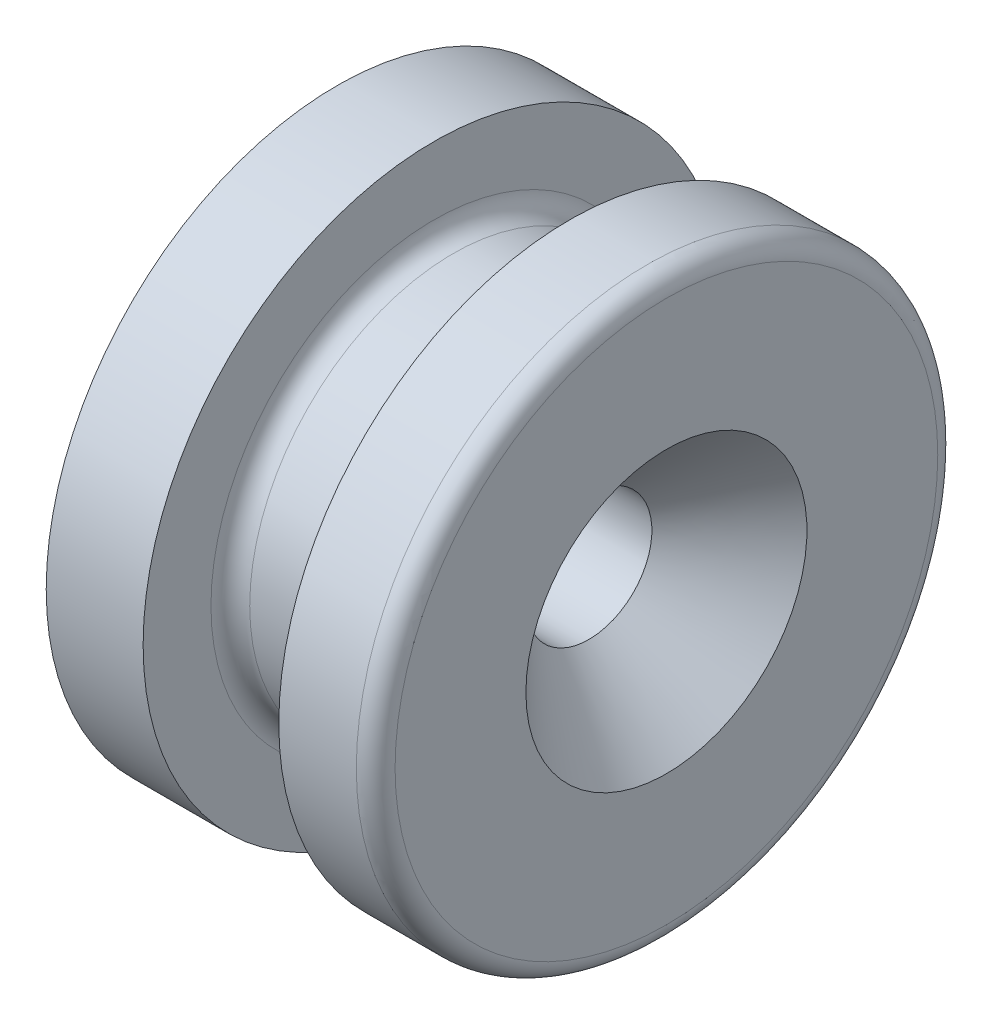
ISO-10303-21;
HEADER;
FILE_DESCRIPTION(('STEP AP214'),'2;1');
FILE_NAME('part.step','',(''),(''),'','','');
FILE_SCHEMA(('AUTOMOTIVE_DESIGN { 1 0 10303 214 1 1 1 1 }'));
ENDSEC;
DATA;
#1=APPLICATION_CONTEXT('core data for automotive mechanical design processes');
#2=APPLICATION_PROTOCOL_DEFINITION('international standard','automotive_design',2000,#1);
#3=PRODUCT_CONTEXT('',#1,'mechanical');
#4=PRODUCT('Part','Part','',(#3));
#5=PRODUCT_RELATED_PRODUCT_CATEGORY('part','',(#4));
#6=PRODUCT_DEFINITION_FORMATION('','',#4);
#7=PRODUCT_DEFINITION_CONTEXT('part definition',#1,'design');
#8=PRODUCT_DEFINITION('design','',#6,#7);
#9=PRODUCT_DEFINITION_SHAPE('','',#8);
#10=(LENGTH_UNIT() NAMED_UNIT(*) SI_UNIT(.MILLI.,.METRE.));
#11=(NAMED_UNIT(*) PLANE_ANGLE_UNIT() SI_UNIT($,.RADIAN.));
#12=(NAMED_UNIT(*) SI_UNIT($,.STERADIAN.) SOLID_ANGLE_UNIT());
#13=UNCERTAINTY_MEASURE_WITH_UNIT(LENGTH_MEASURE(1.E-05),#10,'distance_accuracy_value','');
#14=(GEOMETRIC_REPRESENTATION_CONTEXT(3) GLOBAL_UNCERTAINTY_ASSIGNED_CONTEXT((#13)) GLOBAL_UNIT_ASSIGNED_CONTEXT((#10,
#11,#12)) REPRESENTATION_CONTEXT('',''));
#15=CARTESIAN_POINT('',(0.,0.,0.));
#16=DIRECTION('',(0.,0.,1.));
#17=DIRECTION('',(1.,0.,0.));
#18=AXIS2_PLACEMENT_3D('',#15,#16,#17);
#19=CARTESIAN_POINT('',(17.,3.25,0.));
#20=DIRECTION('',(-1.,0.,0.));
#21=DIRECTION('',(0.,0.,1.));
#22=AXIS2_PLACEMENT_3D('',#19,#20,#21);
#23=PLANE('',#22);
#24=CARTESIAN_POINT('',(17.,0.,0.));
#25=DIRECTION('',(-1.,0.,0.));
#26=DIRECTION('',(0.,0.,1.));
#27=AXIS2_PLACEMENT_3D('',#24,#25,#26);
#28=CIRCLE('',#27,7.24999999999999);
#29=CARTESIAN_POINT('',(17.,0.,7.24999999999999));
#30=VERTEX_POINT('',#29);
#31=EDGE_CURVE('E42',#30,#30,#28,.T.);
#32=ORIENTED_EDGE('',*,*,#31,.T.);
#33=EDGE_LOOP('',(#32));
#34=FACE_BOUND('',#33,.T.);
#35=CARTESIAN_POINT('',(17.,0.,0.));
#36=DIRECTION('',(-1.,0.,0.));
#37=DIRECTION('',(0.,0.,1.));
#38=AXIS2_PLACEMENT_3D('',#35,#36,#37);
#39=CIRCLE('',#38,14.);
#40=CARTESIAN_POINT('',(17.,0.,14.));
#41=VERTEX_POINT('',#40);
#42=EDGE_CURVE('E61',#41,#41,#39,.F.);
#43=ORIENTED_EDGE('',*,*,#42,.T.);
#44=EDGE_LOOP('',(#43));
#45=FACE_BOUND('',#44,.T.);
#46=ADVANCED_FACE('F35',(#34,#45),#23,.F.);
#47=CARTESIAN_POINT('',(-8.12193012798341,0.,0.));
#48=DIRECTION('',(-1.,0.,0.));
#49=DIRECTION('',(0.,0.,1.));
#50=AXIS2_PLACEMENT_3D('',#47,#48,#49);
#51=CYLINDRICAL_SURFACE('',#50,3.25);
#52=CARTESIAN_POINT('',(13.,0.,0.));
#53=DIRECTION('',(-1.,0.,0.));
#54=DIRECTION('',(0.,0.,1.));
#55=AXIS2_PLACEMENT_3D('',#52,#53,#54);
#56=CIRCLE('',#55,3.25);
#57=CARTESIAN_POINT('',(13.,0.,3.25));
#58=VERTEX_POINT('',#57);
#59=EDGE_CURVE('E10',#58,#58,#56,.F.);
#60=ORIENTED_EDGE('',*,*,#59,.T.);
#61=EDGE_LOOP('',(#60));
#62=FACE_BOUND('',#61,.T.);
#63=CARTESIAN_POINT('',(0.,0.,0.));
#64=DIRECTION('',(-1.,0.,0.));
#65=DIRECTION('',(0.,0.,1.));
#66=AXIS2_PLACEMENT_3D('',#63,#64,#65);
#67=CIRCLE('',#66,3.25);
#68=CARTESIAN_POINT('',(0.,0.,3.25));
#69=VERTEX_POINT('',#68);
#70=EDGE_CURVE('E67',#69,#69,#67,.T.);
#71=ORIENTED_EDGE('',*,*,#70,.T.);
#72=EDGE_LOOP('',(#71));
#73=FACE_BOUND('',#72,.T.);
#74=ADVANCED_FACE('F98',(#62,#73),#51,.F.);
#75=CARTESIAN_POINT('',(0.,3.25,0.));
#76=DIRECTION('',(1.,0.,0.));
#77=DIRECTION('',(0.,0.,-1.));
#78=AXIS2_PLACEMENT_3D('',#75,#76,#77);
#79=PLANE('',#78);
#80=ORIENTED_EDGE('',*,*,#70,.F.);
#81=EDGE_LOOP('',(#80));
#82=FACE_BOUND('',#81,.T.);
#83=CARTESIAN_POINT('',(0.,0.,0.));
#84=DIRECTION('',(-1.,0.,0.));
#85=DIRECTION('',(0.,0.,1.));
#86=AXIS2_PLACEMENT_3D('',#83,#84,#85);
#87=CIRCLE('',#86,15.);
#88=CARTESIAN_POINT('',(0.,0.,15.));
#89=VERTEX_POINT('',#88);
#90=EDGE_CURVE('E70',#89,#89,#87,.T.);
#91=ORIENTED_EDGE('',*,*,#90,.T.);
#92=EDGE_LOOP('',(#91));
#93=FACE_BOUND('',#92,.T.);
#94=ADVANCED_FACE('F103',(#82,#93),#79,.F.);
#95=CARTESIAN_POINT('',(-8.12193012798341,0.,0.));
#96=DIRECTION('',(-1.,0.,0.));
#97=DIRECTION('',(0.,0.,1.));
#98=AXIS2_PLACEMENT_3D('',#95,#96,#97);
#99=CYLINDRICAL_SURFACE('',#98,15.);
#100=ORIENTED_EDGE('',*,*,#90,.F.);
#101=EDGE_LOOP('',(#100));
#102=FACE_BOUND('',#101,.T.);
#103=CARTESIAN_POINT('',(5.,0.,0.));
#104=DIRECTION('',(-1.,0.,0.));
#105=DIRECTION('',(0.,0.,1.));
#106=AXIS2_PLACEMENT_3D('',#103,#104,#105);
#107=CIRCLE('',#106,15.);
#108=CARTESIAN_POINT('',(5.,0.,15.));
#109=VERTEX_POINT('',#108);
#110=EDGE_CURVE('E73',#109,#109,#107,.T.);
#111=ORIENTED_EDGE('',*,*,#110,.T.);
#112=EDGE_LOOP('',(#111));
#113=FACE_BOUND('',#112,.T.);
#114=ADVANCED_FACE('F124',(#102,#113),#99,.T.);
#115=CARTESIAN_POINT('',(5.,15.,0.));
#116=DIRECTION('',(-1.,0.,0.));
#117=DIRECTION('',(0.,0.,1.));
#118=AXIS2_PLACEMENT_3D('',#115,#116,#117);
#119=PLANE('',#118);
#120=CARTESIAN_POINT('',(5.,0.,0.));
#121=DIRECTION('',(-1.,0.,0.));
#122=DIRECTION('',(0.,0.,1.));
#123=AXIS2_PLACEMENT_3D('',#120,#121,#122);
#124=CIRCLE('',#123,11.5);
#125=CARTESIAN_POINT('',(5.,0.,11.5));
#126=VERTEX_POINT('',#125);
#127=EDGE_CURVE('E46',#126,#126,#124,.T.);
#128=ORIENTED_EDGE('',*,*,#127,.T.);
#129=EDGE_LOOP('',(#128));
#130=FACE_BOUND('',#129,.T.);
#131=ORIENTED_EDGE('',*,*,#110,.F.);
#132=EDGE_LOOP('',(#131));
#133=FACE_BOUND('',#132,.T.);
#134=ADVANCED_FACE('F121',(#130,#133),#119,.F.);
#135=CARTESIAN_POINT('',(-8.12193012798341,0.,0.));
#136=DIRECTION('',(-1.,0.,0.));
#137=DIRECTION('',(0.,0.,1.));
#138=AXIS2_PLACEMENT_3D('',#135,#136,#137);
#139=CYLINDRICAL_SURFACE('',#138,10.5);
#140=CARTESIAN_POINT('',(11.,0.,0.));
#141=DIRECTION('',(1.,0.,0.));
#142=DIRECTION('',(0.,0.,-1.));
#143=AXIS2_PLACEMENT_3D('',#140,#141,#142);
#144=CIRCLE('',#143,10.5);
#145=CARTESIAN_POINT('',(11.,0.,-10.5));
#146=VERTEX_POINT('',#145);
#147=EDGE_CURVE('E55',#146,#146,#144,.F.);
#148=ORIENTED_EDGE('',*,*,#147,.T.);
#149=EDGE_LOOP('',(#148));
#150=FACE_BOUND('',#149,.T.);
#151=CARTESIAN_POINT('',(6.,0.,0.));
#152=DIRECTION('',(-1.,0.,0.));
#153=DIRECTION('',(0.,0.,1.));
#154=AXIS2_PLACEMENT_3D('',#151,#152,#153);
#155=CIRCLE('',#154,10.5);
#156=CARTESIAN_POINT('',(6.,0.,10.5));
#157=VERTEX_POINT('',#156);
#158=EDGE_CURVE('E58',#157,#157,#155,.F.);
#159=ORIENTED_EDGE('',*,*,#158,.T.);
#160=EDGE_LOOP('',(#159));
#161=FACE_BOUND('',#160,.T.);
#162=ADVANCED_FACE('F94',(#150,#161),#139,.T.);
#163=CARTESIAN_POINT('',(12.,15.,0.));
#164=DIRECTION('',(1.,0.,0.));
#165=DIRECTION('',(0.,0.,-1.));
#166=AXIS2_PLACEMENT_3D('',#163,#164,#165);
#167=PLANE('',#166);
#168=CARTESIAN_POINT('',(12.,0.,0.));
#169=DIRECTION('',(1.,0.,0.));
#170=DIRECTION('',(0.,0.,-1.));
#171=AXIS2_PLACEMENT_3D('',#168,#169,#170);
#172=CIRCLE('',#171,11.5);
#173=CARTESIAN_POINT('',(12.,0.,-11.5));
#174=VERTEX_POINT('',#173);
#175=EDGE_CURVE('E50',#174,#174,#172,.T.);
#176=ORIENTED_EDGE('',*,*,#175,.T.);
#177=EDGE_LOOP('',(#176));
#178=FACE_BOUND('',#177,.T.);
#179=CARTESIAN_POINT('',(12.,0.,0.));
#180=DIRECTION('',(-1.,0.,0.));
#181=DIRECTION('',(0.,0.,1.));
#182=AXIS2_PLACEMENT_3D('',#179,#180,#181);
#183=CIRCLE('',#182,15.);
#184=CARTESIAN_POINT('',(12.,0.,15.));
#185=VERTEX_POINT('',#184);
#186=EDGE_CURVE('E76',#185,#185,#183,.T.);
#187=ORIENTED_EDGE('',*,*,#186,.T.);
#188=EDGE_LOOP('',(#187));
#189=FACE_BOUND('',#188,.T.);
#190=ADVANCED_FACE('F80',(#178,#189),#167,.F.);
#191=CARTESIAN_POINT('',(-8.12193012798341,0.,0.));
#192=DIRECTION('',(-1.,0.,0.));
#193=DIRECTION('',(0.,0.,1.));
#194=AXIS2_PLACEMENT_3D('',#191,#192,#193);
#195=CYLINDRICAL_SURFACE('',#194,15.);
#196=CARTESIAN_POINT('',(16.,0.,0.));
#197=DIRECTION('',(-1.,0.,0.));
#198=DIRECTION('',(0.,0.,1.));
#199=AXIS2_PLACEMENT_3D('',#196,#197,#198);
#200=CIRCLE('',#199,15.);
#201=CARTESIAN_POINT('',(16.,0.,15.));
#202=VERTEX_POINT('',#201);
#203=EDGE_CURVE('E64',#202,#202,#200,.T.);
#204=ORIENTED_EDGE('',*,*,#203,.T.);
#205=EDGE_LOOP('',(#204));
#206=FACE_BOUND('',#205,.T.);
#207=ORIENTED_EDGE('',*,*,#186,.F.);
#208=EDGE_LOOP('',(#207));
#209=FACE_BOUND('',#208,.T.);
#210=ADVANCED_FACE('F82',(#206,#209),#195,.T.);
#211=CARTESIAN_POINT('',(16.,0.,0.));
#212=DIRECTION('',(-1.,0.,0.));
#213=DIRECTION('',(0.,0.,1.));
#214=AXIS2_PLACEMENT_3D('',#211,#212,#213);
#215=TOROIDAL_SURFACE('',#214,14.,1.);
#216=ORIENTED_EDGE('',*,*,#42,.F.);
#217=EDGE_LOOP('',(#216));
#218=FACE_BOUND('',#217,.T.);
#219=ORIENTED_EDGE('',*,*,#203,.F.);
#220=EDGE_LOOP('',(#219));
#221=FACE_BOUND('',#220,.T.);
#222=ADVANCED_FACE('F84',(#218,#221),#215,.T.);
#223=CARTESIAN_POINT('',(11.,0.,0.));
#224=DIRECTION('',(1.,0.,0.));
#225=DIRECTION('',(0.,0.,-1.));
#226=AXIS2_PLACEMENT_3D('',#223,#224,#225);
#227=TOROIDAL_SURFACE('',#226,11.5,1.);
#228=ORIENTED_EDGE('',*,*,#175,.F.);
#229=EDGE_LOOP('',(#228));
#230=FACE_BOUND('',#229,.T.);
#231=ORIENTED_EDGE('',*,*,#147,.F.);
#232=EDGE_LOOP('',(#231));
#233=FACE_BOUND('',#232,.T.);
#234=ADVANCED_FACE('F91',(#230,#233),#227,.F.);
#235=CARTESIAN_POINT('',(6.,0.,0.));
#236=DIRECTION('',(-1.,0.,0.));
#237=DIRECTION('',(0.,0.,1.));
#238=AXIS2_PLACEMENT_3D('',#235,#236,#237);
#239=TOROIDAL_SURFACE('',#238,11.5,1.);
#240=ORIENTED_EDGE('',*,*,#158,.F.);
#241=EDGE_LOOP('',(#240));
#242=FACE_BOUND('',#241,.T.);
#243=ORIENTED_EDGE('',*,*,#127,.F.);
#244=EDGE_LOOP('',(#243));
#245=FACE_BOUND('',#244,.T.);
#246=ADVANCED_FACE('F109',(#242,#245),#239,.F.);
#247=CARTESIAN_POINT('',(17.,0.,0.));
#248=DIRECTION('',(1.,0.,0.));
#249=DIRECTION('',(0.,0.,-1.));
#250=AXIS2_PLACEMENT_3D('',#247,#248,#249);
#251=CONICAL_SURFACE('',#250,7.24999999999999,0.785398163397446);
#252=ORIENTED_EDGE('',*,*,#59,.F.);
#253=EDGE_LOOP('',(#252));
#254=FACE_BOUND('',#253,.T.);
#255=ORIENTED_EDGE('',*,*,#31,.F.);
#256=EDGE_LOOP('',(#255));
#257=FACE_BOUND('',#256,.T.);
#258=ADVANCED_FACE('F37',(#254,#257),#251,.F.);
#259=CLOSED_SHELL('',(#46,#74,#94,#114,#134,#162,#190,#210,#222,#234,#246,#258));
#260=MANIFOLD_SOLID_BREP('B2',#259);
#261=ADVANCED_BREP_SHAPE_REPRESENTATION('',(#18,#260),#14);
#262=SHAPE_DEFINITION_REPRESENTATION(#9,#261);
ENDSEC;
END-ISO-10303-21;
